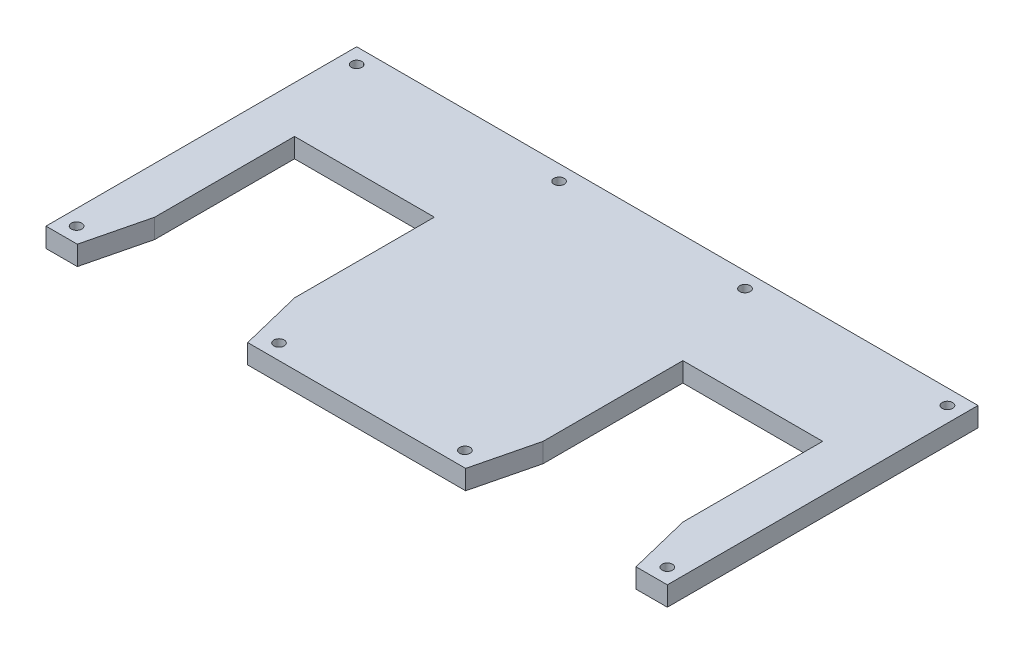
ISO-10303-21;
HEADER;
FILE_DESCRIPTION(('STEP AP214'),'2;1');
FILE_NAME('part.step','',(''),(''),'','','');
FILE_SCHEMA(('AUTOMOTIVE_DESIGN { 1 0 10303 214 1 1 1 1 }'));
ENDSEC;
DATA;
#1=APPLICATION_CONTEXT('core data for automotive mechanical design processes');
#2=APPLICATION_PROTOCOL_DEFINITION('international standard','automotive_design',2000,#1);
#3=PRODUCT_CONTEXT('',#1,'mechanical');
#4=PRODUCT('Part','Part','',(#3));
#5=PRODUCT_RELATED_PRODUCT_CATEGORY('part','',(#4));
#6=PRODUCT_DEFINITION_FORMATION('','',#4);
#7=PRODUCT_DEFINITION_CONTEXT('part definition',#1,'design');
#8=PRODUCT_DEFINITION('design','',#6,#7);
#9=PRODUCT_DEFINITION_SHAPE('','',#8);
#10=(LENGTH_UNIT() NAMED_UNIT(*) SI_UNIT(.MILLI.,.METRE.));
#11=(NAMED_UNIT(*) PLANE_ANGLE_UNIT() SI_UNIT($,.RADIAN.));
#12=(NAMED_UNIT(*) SI_UNIT($,.STERADIAN.) SOLID_ANGLE_UNIT());
#13=UNCERTAINTY_MEASURE_WITH_UNIT(LENGTH_MEASURE(1.E-05),#10,'distance_accuracy_value','');
#14=(GEOMETRIC_REPRESENTATION_CONTEXT(3) GLOBAL_UNCERTAINTY_ASSIGNED_CONTEXT((#13)) GLOBAL_UNIT_ASSIGNED_CONTEXT((#10,
#11,#12)) REPRESENTATION_CONTEXT('',''));
#15=CARTESIAN_POINT('',(0.,0.,0.));
#16=DIRECTION('',(0.,0.,1.));
#17=DIRECTION('',(1.,0.,0.));
#18=AXIS2_PLACEMENT_3D('',#15,#16,#17);
#19=CARTESIAN_POINT('',(0.,6.35,0.));
#20=DIRECTION('',(0.,0.,-1.));
#21=DIRECTION('',(-1.,0.,0.));
#22=AXIS2_PLACEMENT_3D('',#19,#20,#21);
#23=PLANE('',#22);
#24=DIRECTION('',(1.,0.,0.));
#25=VECTOR('',#24,1.);
#26=CARTESIAN_POINT('',(0.,0.,0.));
#27=LINE('',#26,#25);
#28=CARTESIAN_POINT('',(-61.04,0.,0.));
#29=VERTEX_POINT('',#28);
#30=CARTESIAN_POINT('',(10.24,0.,0.));
#31=VERTEX_POINT('',#30);
#32=EDGE_CURVE('E145',#29,#31,#27,.T.);
#33=ORIENTED_EDGE('',*,*,#32,.T.);
#34=DIRECTION('',(0.,-1.,0.));
#35=VECTOR('',#34,1.);
#36=CARTESIAN_POINT('',(10.24,6.35,0.));
#37=LINE('',#36,#35);
#38=CARTESIAN_POINT('',(10.24,6.35,0.));
#39=VERTEX_POINT('',#38);
#40=EDGE_CURVE('E11',#39,#31,#37,.T.);
#41=ORIENTED_EDGE('',*,*,#40,.F.);
#42=DIRECTION('',(1.,0.,0.));
#43=VECTOR('',#42,1.);
#44=CARTESIAN_POINT('',(0.,6.35,0.));
#45=LINE('',#44,#43);
#46=CARTESIAN_POINT('',(-61.04,6.35,0.));
#47=VERTEX_POINT('',#46);
#48=EDGE_CURVE('E101',#47,#39,#45,.T.);
#49=ORIENTED_EDGE('',*,*,#48,.F.);
#50=DIRECTION('',(0.,-1.,0.));
#51=VECTOR('',#50,1.);
#52=CARTESIAN_POINT('',(-61.04,6.35,0.));
#53=LINE('',#52,#51);
#54=EDGE_CURVE('E210',#47,#29,#53,.T.);
#55=ORIENTED_EDGE('',*,*,#54,.T.);
#56=EDGE_LOOP('',(#33,#41,#49,#55));
#57=FACE_BOUND('',#56,.T.);
#58=ADVANCED_FACE('F41',(#57),#23,.F.);
#59=CARTESIAN_POINT('',(10.24,6.35,0.));
#60=DIRECTION('',(-0.971035351018297,0.,-0.238935863931668));
#61=DIRECTION('',(-0.238935863931668,0.,0.971035351018297));
#62=AXIS2_PLACEMENT_3D('',#59,#60,#61);
#63=PLANE('',#62);
#64=DIRECTION('',(0.238935863931668,0.,-0.971035351018297));
#65=VECTOR('',#64,1.);
#66=CARTESIAN_POINT('',(10.24,0.,0.));
#67=LINE('',#66,#65);
#68=CARTESIAN_POINT('',(15.24,0.,-20.32));
#69=VERTEX_POINT('',#68);
#70=EDGE_CURVE('E147',#31,#69,#67,.T.);
#71=ORIENTED_EDGE('',*,*,#70,.T.);
#72=DIRECTION('',(0.,-1.,0.));
#73=VECTOR('',#72,1.);
#74=CARTESIAN_POINT('',(15.24,6.35,-20.32));
#75=LINE('',#74,#73);
#76=CARTESIAN_POINT('',(15.24,6.35,-20.32));
#77=VERTEX_POINT('',#76);
#78=EDGE_CURVE('E49',#77,#69,#75,.T.);
#79=ORIENTED_EDGE('',*,*,#78,.F.);
#80=DIRECTION('',(0.238935863931668,0.,-0.971035351018297));
#81=VECTOR('',#80,1.);
#82=CARTESIAN_POINT('',(10.24,6.35,0.));
#83=LINE('',#82,#81);
#84=EDGE_CURVE('E197',#39,#77,#83,.T.);
#85=ORIENTED_EDGE('',*,*,#84,.F.);
#86=ORIENTED_EDGE('',*,*,#40,.T.);
#87=EDGE_LOOP('',(#71,#79,#85,#86));
#88=FACE_BOUND('',#87,.T.);
#89=ADVANCED_FACE('F333',(#88),#63,.F.);
#90=CARTESIAN_POINT('',(15.24,6.35,-20.32));
#91=DIRECTION('',(-1.,0.,0.));
#92=DIRECTION('',(0.,0.,1.));
#93=AXIS2_PLACEMENT_3D('',#90,#91,#92);
#94=PLANE('',#93);
#95=DIRECTION('',(0.,0.,-1.));
#96=VECTOR('',#95,1.);
#97=CARTESIAN_POINT('',(15.24,0.,-20.32));
#98=LINE('',#97,#96);
#99=CARTESIAN_POINT('',(15.24,0.,-66.04));
#100=VERTEX_POINT('',#99);
#101=EDGE_CURVE('E150',#69,#100,#98,.T.);
#102=ORIENTED_EDGE('',*,*,#101,.T.);
#103=DIRECTION('',(0.,-1.,0.));
#104=VECTOR('',#103,1.);
#105=CARTESIAN_POINT('',(15.24,6.35,-66.04));
#106=LINE('',#105,#104);
#107=CARTESIAN_POINT('',(15.24,6.35,-66.04));
#108=VERTEX_POINT('',#107);
#109=EDGE_CURVE('E168',#108,#100,#106,.T.);
#110=ORIENTED_EDGE('',*,*,#109,.F.);
#111=DIRECTION('',(0.,0.,-1.));
#112=VECTOR('',#111,1.);
#113=CARTESIAN_POINT('',(15.24,6.35,-20.32));
#114=LINE('',#113,#112);
#115=EDGE_CURVE('E177',#77,#108,#114,.T.);
#116=ORIENTED_EDGE('',*,*,#115,.F.);
#117=ORIENTED_EDGE('',*,*,#78,.T.);
#118=EDGE_LOOP('',(#102,#110,#116,#117));
#119=FACE_BOUND('',#118,.T.);
#120=ADVANCED_FACE('F175',(#119),#94,.F.);
#121=CARTESIAN_POINT('',(15.24,6.35,-66.04));
#122=DIRECTION('',(0.,0.,-1.));
#123=DIRECTION('',(-1.,0.,0.));
#124=AXIS2_PLACEMENT_3D('',#121,#122,#123);
#125=PLANE('',#124);
#126=DIRECTION('',(1.,0.,0.));
#127=VECTOR('',#126,1.);
#128=CARTESIAN_POINT('',(15.24,0.,-66.04));
#129=LINE('',#128,#127);
#130=CARTESIAN_POINT('',(60.96,0.,-66.04));
#131=VERTEX_POINT('',#130);
#132=EDGE_CURVE('E152',#100,#131,#129,.T.);
#133=ORIENTED_EDGE('',*,*,#132,.T.);
#134=DIRECTION('',(0.,-1.,0.));
#135=VECTOR('',#134,1.);
#136=CARTESIAN_POINT('',(60.96,6.35,-66.04));
#137=LINE('',#136,#135);
#138=CARTESIAN_POINT('',(60.96,6.35,-66.04));
#139=VERTEX_POINT('',#138);
#140=EDGE_CURVE('E165',#139,#131,#137,.T.);
#141=ORIENTED_EDGE('',*,*,#140,.F.);
#142=DIRECTION('',(1.,0.,0.));
#143=VECTOR('',#142,1.);
#144=CARTESIAN_POINT('',(15.24,6.35,-66.04));
#145=LINE('',#144,#143);
#146=EDGE_CURVE('E193',#108,#139,#145,.T.);
#147=ORIENTED_EDGE('',*,*,#146,.F.);
#148=ORIENTED_EDGE('',*,*,#109,.T.);
#149=EDGE_LOOP('',(#133,#141,#147,#148));
#150=FACE_BOUND('',#149,.T.);
#151=ADVANCED_FACE('F189',(#150),#125,.F.);
#152=CARTESIAN_POINT('',(60.96,6.35,-66.04));
#153=DIRECTION('',(1.,0.,0.));
#154=DIRECTION('',(0.,0.,-1.));
#155=AXIS2_PLACEMENT_3D('',#152,#153,#154);
#156=PLANE('',#155);
#157=DIRECTION('',(0.,0.,1.));
#158=VECTOR('',#157,1.);
#159=CARTESIAN_POINT('',(60.96,0.,-66.04));
#160=LINE('',#159,#158);
#161=CARTESIAN_POINT('',(60.96,0.,-20.32));
#162=VERTEX_POINT('',#161);
#163=EDGE_CURVE('E154',#131,#162,#160,.T.);
#164=ORIENTED_EDGE('',*,*,#163,.T.);
#165=DIRECTION('',(0.,-1.,0.));
#166=VECTOR('',#165,1.);
#167=CARTESIAN_POINT('',(60.96,6.35,-20.32));
#168=LINE('',#167,#166);
#169=CARTESIAN_POINT('',(60.96,6.35,-20.32));
#170=VERTEX_POINT('',#169);
#171=EDGE_CURVE('E134',#170,#162,#168,.T.);
#172=ORIENTED_EDGE('',*,*,#171,.F.);
#173=DIRECTION('',(0.,0.,1.));
#174=VECTOR('',#173,1.);
#175=CARTESIAN_POINT('',(60.96,6.35,-66.04));
#176=LINE('',#175,#174);
#177=EDGE_CURVE('E125',#139,#170,#176,.T.);
#178=ORIENTED_EDGE('',*,*,#177,.F.);
#179=ORIENTED_EDGE('',*,*,#140,.T.);
#180=EDGE_LOOP('',(#164,#172,#178,#179));
#181=FACE_BOUND('',#180,.T.);
#182=ADVANCED_FACE('F192',(#181),#156,.F.);
#183=CARTESIAN_POINT('',(60.96,6.35,-20.32));
#184=DIRECTION('',(0.971035351018297,0.,-0.238935863931668));
#185=DIRECTION('',(-0.238935863931668,0.,-0.971035351018297));
#186=AXIS2_PLACEMENT_3D('',#183,#184,#185);
#187=PLANE('',#186);
#188=DIRECTION('',(0.238935863931668,0.,0.971035351018297));
#189=VECTOR('',#188,1.);
#190=CARTESIAN_POINT('',(60.96,0.,-20.32));
#191=LINE('',#190,#189);
#192=CARTESIAN_POINT('',(65.96,0.,0.));
#193=VERTEX_POINT('',#192);
#194=EDGE_CURVE('E133',#162,#193,#191,.T.);
#195=ORIENTED_EDGE('',*,*,#194,.T.);
#196=DIRECTION('',(0.,-1.,0.));
#197=VECTOR('',#196,1.);
#198=CARTESIAN_POINT('',(65.96,6.35,0.));
#199=LINE('',#198,#197);
#200=CARTESIAN_POINT('',(65.96,6.35,0.));
#201=VERTEX_POINT('',#200);
#202=EDGE_CURVE('E130',#201,#193,#199,.T.);
#203=ORIENTED_EDGE('',*,*,#202,.F.);
#204=DIRECTION('',(0.238935863931668,0.,0.971035351018297));
#205=VECTOR('',#204,1.);
#206=CARTESIAN_POINT('',(60.96,6.35,-20.32));
#207=LINE('',#206,#205);
#208=EDGE_CURVE('E118',#170,#201,#207,.T.);
#209=ORIENTED_EDGE('',*,*,#208,.F.);
#210=ORIENTED_EDGE('',*,*,#171,.T.);
#211=EDGE_LOOP('',(#195,#203,#209,#210));
#212=FACE_BOUND('',#211,.T.);
#213=ADVANCED_FACE('F131',(#212),#187,.F.);
#214=CARTESIAN_POINT('',(65.96,6.35,0.));
#215=DIRECTION('',(0.,0.,-1.));
#216=DIRECTION('',(-1.,0.,0.));
#217=AXIS2_PLACEMENT_3D('',#214,#215,#216);
#218=PLANE('',#217);
#219=DIRECTION('',(1.,0.,0.));
#220=VECTOR('',#219,1.);
#221=CARTESIAN_POINT('',(65.96,0.,0.));
#222=LINE('',#221,#220);
#223=CARTESIAN_POINT('',(76.2,0.,0.));
#224=VERTEX_POINT('',#223);
#225=EDGE_CURVE('E87',#193,#224,#222,.T.);
#226=ORIENTED_EDGE('',*,*,#225,.T.);
#227=DIRECTION('',(0.,-1.,0.));
#228=VECTOR('',#227,1.);
#229=CARTESIAN_POINT('',(76.2,6.35,0.));
#230=LINE('',#229,#228);
#231=CARTESIAN_POINT('',(76.2,6.35,0.));
#232=VERTEX_POINT('',#231);
#233=EDGE_CURVE('E135',#232,#224,#230,.T.);
#234=ORIENTED_EDGE('',*,*,#233,.F.);
#235=DIRECTION('',(1.,0.,0.));
#236=VECTOR('',#235,1.);
#237=CARTESIAN_POINT('',(65.96,6.35,0.));
#238=LINE('',#237,#236);
#239=EDGE_CURVE('E123',#201,#232,#238,.T.);
#240=ORIENTED_EDGE('',*,*,#239,.F.);
#241=ORIENTED_EDGE('',*,*,#202,.T.);
#242=EDGE_LOOP('',(#226,#234,#240,#241));
#243=FACE_BOUND('',#242,.T.);
#244=ADVANCED_FACE('F137',(#243),#218,.F.);
#245=CARTESIAN_POINT('',(76.2,6.35,0.));
#246=DIRECTION('',(-1.,0.,0.));
#247=DIRECTION('',(0.,0.,1.));
#248=AXIS2_PLACEMENT_3D('',#245,#246,#247);
#249=PLANE('',#248);
#250=DIRECTION('',(0.,0.,-1.));
#251=VECTOR('',#250,1.);
#252=CARTESIAN_POINT('',(76.2,0.,0.));
#253=LINE('',#252,#251);
#254=CARTESIAN_POINT('',(76.2,0.,-101.6));
#255=VERTEX_POINT('',#254);
#256=EDGE_CURVE('E93',#224,#255,#253,.T.);
#257=ORIENTED_EDGE('',*,*,#256,.T.);
#258=DIRECTION('',(0.,-1.,0.));
#259=VECTOR('',#258,1.);
#260=CARTESIAN_POINT('',(76.2,6.35,-101.6));
#261=LINE('',#260,#259);
#262=CARTESIAN_POINT('',(76.2,6.35,-101.6));
#263=VERTEX_POINT('',#262);
#264=EDGE_CURVE('E144',#263,#255,#261,.T.);
#265=ORIENTED_EDGE('',*,*,#264,.F.);
#266=DIRECTION('',(0.,0.,-1.));
#267=VECTOR('',#266,1.);
#268=CARTESIAN_POINT('',(76.2,6.35,0.));
#269=LINE('',#268,#267);
#270=EDGE_CURVE('E57',#232,#263,#269,.T.);
#271=ORIENTED_EDGE('',*,*,#270,.F.);
#272=ORIENTED_EDGE('',*,*,#233,.T.);
#273=EDGE_LOOP('',(#257,#265,#271,#272));
#274=FACE_BOUND('',#273,.T.);
#275=ADVANCED_FACE('F440',(#274),#249,.F.);
#276=CARTESIAN_POINT('',(0.,6.35,-101.6));
#277=DIRECTION('',(0.,0.,1.));
#278=DIRECTION('',(1.,0.,0.));
#279=AXIS2_PLACEMENT_3D('',#276,#277,#278);
#280=PLANE('',#279);
#281=DIRECTION('',(-1.,0.,0.));
#282=VECTOR('',#281,1.);
#283=CARTESIAN_POINT('',(0.,0.,-101.6));
#284=LINE('',#283,#282);
#285=CARTESIAN_POINT('',(-127.,0.,-101.6));
#286=VERTEX_POINT('',#285);
#287=EDGE_CURVE('E159',#255,#286,#284,.T.);
#288=ORIENTED_EDGE('',*,*,#287,.T.);
#289=DIRECTION('',(0.,-1.,0.));
#290=VECTOR('',#289,1.);
#291=CARTESIAN_POINT('',(-127.,6.35,-101.6));
#292=LINE('',#291,#290);
#293=CARTESIAN_POINT('',(-127.,6.35,-101.6));
#294=VERTEX_POINT('',#293);
#295=EDGE_CURVE('E244',#294,#286,#292,.T.);
#296=ORIENTED_EDGE('',*,*,#295,.F.);
#297=DIRECTION('',(-1.,0.,0.));
#298=VECTOR('',#297,1.);
#299=CARTESIAN_POINT('',(0.,6.35,-101.6));
#300=LINE('',#299,#298);
#301=EDGE_CURVE('E139',#263,#294,#300,.T.);
#302=ORIENTED_EDGE('',*,*,#301,.F.);
#303=ORIENTED_EDGE('',*,*,#264,.T.);
#304=EDGE_LOOP('',(#288,#296,#302,#303));
#305=FACE_BOUND('',#304,.T.);
#306=ADVANCED_FACE('F392',(#305),#280,.F.);
#307=CARTESIAN_POINT('',(0.,6.35,0.));
#308=DIRECTION('',(0.,-1.,0.));
#309=DIRECTION('',(0.,0.,-1.));
#310=AXIS2_PLACEMENT_3D('',#307,#308,#309);
#311=PLANE('',#310);
#312=CARTESIAN_POINT('',(5.,6.35,-5.));
#313=DIRECTION('',(0.,1.,0.));
#314=DIRECTION('',(0.,0.,-1.));
#315=AXIS2_PLACEMENT_3D('',#312,#313,#314);
#316=CIRCLE('',#315,1.7);
#317=CARTESIAN_POINT('',(5.,6.35,-6.7));
#318=VERTEX_POINT('',#317);
#319=EDGE_CURVE('E209',#318,#318,#316,.T.);
#320=ORIENTED_EDGE('',*,*,#319,.F.);
#321=EDGE_LOOP('',(#320));
#322=FACE_BOUND('',#321,.T.);
#323=CARTESIAN_POINT('',(71.2,6.35,-5.00000000000002));
#324=DIRECTION('',(0.,1.,0.));
#325=DIRECTION('',(0.,0.,1.));
#326=AXIS2_PLACEMENT_3D('',#323,#324,#325);
#327=CIRCLE('',#326,1.7);
#328=CARTESIAN_POINT('',(71.2,6.35,-3.30000000000002));
#329=VERTEX_POINT('',#328);
#330=EDGE_CURVE('E216',#329,#329,#327,.T.);
#331=ORIENTED_EDGE('',*,*,#330,.F.);
#332=EDGE_LOOP('',(#331));
#333=FACE_BOUND('',#332,.T.);
#334=CARTESIAN_POINT('',(71.2,6.35,-96.6));
#335=DIRECTION('',(0.,1.,0.));
#336=DIRECTION('',(0.,0.,-1.));
#337=AXIS2_PLACEMENT_3D('',#334,#335,#336);
#338=CIRCLE('',#337,1.7);
#339=CARTESIAN_POINT('',(71.2,6.35,-98.3));
#340=VERTEX_POINT('',#339);
#341=EDGE_CURVE('E203',#340,#340,#338,.T.);
#342=ORIENTED_EDGE('',*,*,#341,.F.);
#343=EDGE_LOOP('',(#342));
#344=FACE_BOUND('',#343,.T.);
#345=CARTESIAN_POINT('',(5.,6.35,-96.6));
#346=DIRECTION('',(0.,1.,0.));
#347=DIRECTION('',(0.,0.,1.));
#348=AXIS2_PLACEMENT_3D('',#345,#346,#347);
#349=CIRCLE('',#348,1.7);
#350=CARTESIAN_POINT('',(5.,6.35,-94.9));
#351=VERTEX_POINT('',#350);
#352=EDGE_CURVE('E200',#351,#351,#349,.T.);
#353=ORIENTED_EDGE('',*,*,#352,.F.);
#354=EDGE_LOOP('',(#353));
#355=FACE_BOUND('',#354,.T.);
#356=ORIENTED_EDGE('',*,*,#301,.T.);
#357=DIRECTION('',(0.,0.,-1.));
#358=VECTOR('',#357,1.);
#359=CARTESIAN_POINT('',(-127.,6.35,0.));
#360=LINE('',#359,#358);
#361=CARTESIAN_POINT('',(-127.,6.35,0.));
#362=VERTEX_POINT('',#361);
#363=EDGE_CURVE('E247',#362,#294,#360,.T.);
#364=ORIENTED_EDGE('',*,*,#363,.F.);
#365=DIRECTION('',(-1.,0.,0.));
#366=VECTOR('',#365,1.);
#367=CARTESIAN_POINT('',(-116.76,6.35,0.));
#368=LINE('',#367,#366);
#369=CARTESIAN_POINT('',(-116.76,6.35,0.));
#370=VERTEX_POINT('',#369);
#371=EDGE_CURVE('E273',#370,#362,#368,.T.);
#372=ORIENTED_EDGE('',*,*,#371,.F.);
#373=DIRECTION('',(-0.238935863931668,0.,0.971035351018297));
#374=VECTOR('',#373,1.);
#375=CARTESIAN_POINT('',(-111.76,6.35,-20.32));
#376=LINE('',#375,#374);
#377=CARTESIAN_POINT('',(-111.76,6.35,-20.32));
#378=VERTEX_POINT('',#377);
#379=EDGE_CURVE('E276',#378,#370,#376,.T.);
#380=ORIENTED_EDGE('',*,*,#379,.F.);
#381=DIRECTION('',(0.,0.,1.));
#382=VECTOR('',#381,1.);
#383=CARTESIAN_POINT('',(-111.76,6.35,-66.04));
#384=LINE('',#383,#382);
#385=CARTESIAN_POINT('',(-111.76,6.35,-66.04));
#386=VERTEX_POINT('',#385);
#387=EDGE_CURVE('E279',#386,#378,#384,.T.);
#388=ORIENTED_EDGE('',*,*,#387,.F.);
#389=DIRECTION('',(-1.,0.,0.));
#390=VECTOR('',#389,1.);
#391=CARTESIAN_POINT('',(-66.04,6.35,-66.04));
#392=LINE('',#391,#390);
#393=CARTESIAN_POINT('',(-66.04,6.35,-66.04));
#394=VERTEX_POINT('',#393);
#395=EDGE_CURVE('E282',#394,#386,#392,.T.);
#396=ORIENTED_EDGE('',*,*,#395,.F.);
#397=DIRECTION('',(0.,0.,-1.));
#398=VECTOR('',#397,1.);
#399=CARTESIAN_POINT('',(-66.04,6.35,-20.32));
#400=LINE('',#399,#398);
#401=CARTESIAN_POINT('',(-66.04,6.35,-20.32));
#402=VERTEX_POINT('',#401);
#403=EDGE_CURVE('E285',#402,#394,#400,.T.);
#404=ORIENTED_EDGE('',*,*,#403,.F.);
#405=DIRECTION('',(-0.238935863931668,0.,-0.971035351018297));
#406=VECTOR('',#405,1.);
#407=CARTESIAN_POINT('',(-61.04,6.35,0.));
#408=LINE('',#407,#406);
#409=EDGE_CURVE('E251',#47,#402,#408,.T.);
#410=ORIENTED_EDGE('',*,*,#409,.F.);
#411=ORIENTED_EDGE('',*,*,#48,.T.);
#412=ORIENTED_EDGE('',*,*,#84,.T.);
#413=ORIENTED_EDGE('',*,*,#115,.T.);
#414=ORIENTED_EDGE('',*,*,#146,.T.);
#415=ORIENTED_EDGE('',*,*,#177,.T.);
#416=ORIENTED_EDGE('',*,*,#208,.T.);
#417=ORIENTED_EDGE('',*,*,#239,.T.);
#418=ORIENTED_EDGE('',*,*,#270,.T.);
#419=EDGE_LOOP('',(#356,#364,#372,#380,#388,#396,#404,#410,#411,#412,#413,#414,#415,#416,#417,#418));
#420=FACE_BOUND('',#419,.T.);
#421=CARTESIAN_POINT('',(-55.8,6.35,-5.));
#422=DIRECTION('',(0.,-1.,0.));
#423=DIRECTION('',(0.,0.,-1.));
#424=AXIS2_PLACEMENT_3D('',#421,#422,#423);
#425=CIRCLE('',#424,1.7);
#426=CARTESIAN_POINT('',(-55.8,6.35,-6.7));
#427=VERTEX_POINT('',#426);
#428=EDGE_CURVE('E299',#427,#427,#425,.T.);
#429=ORIENTED_EDGE('',*,*,#428,.T.);
#430=EDGE_LOOP('',(#429));
#431=FACE_BOUND('',#430,.T.);
#432=CARTESIAN_POINT('',(-122.,6.35,-5.00000000000002));
#433=DIRECTION('',(0.,-1.,0.));
#434=DIRECTION('',(0.,0.,1.));
#435=AXIS2_PLACEMENT_3D('',#432,#433,#434);
#436=CIRCLE('',#435,1.7);
#437=CARTESIAN_POINT('',(-122.,6.35,-3.30000000000002));
#438=VERTEX_POINT('',#437);
#439=EDGE_CURVE('E305',#438,#438,#436,.T.);
#440=ORIENTED_EDGE('',*,*,#439,.T.);
#441=EDGE_LOOP('',(#440));
#442=FACE_BOUND('',#441,.T.);
#443=CARTESIAN_POINT('',(-122.,6.35,-96.6));
#444=DIRECTION('',(0.,-1.,0.));
#445=DIRECTION('',(0.,0.,-1.));
#446=AXIS2_PLACEMENT_3D('',#443,#444,#445);
#447=CIRCLE('',#446,1.7);
#448=CARTESIAN_POINT('',(-122.,6.35,-98.3));
#449=VERTEX_POINT('',#448);
#450=EDGE_CURVE('E293',#449,#449,#447,.T.);
#451=ORIENTED_EDGE('',*,*,#450,.T.);
#452=EDGE_LOOP('',(#451));
#453=FACE_BOUND('',#452,.T.);
#454=CARTESIAN_POINT('',(-55.8,6.35,-96.6));
#455=DIRECTION('',(0.,-1.,0.));
#456=DIRECTION('',(0.,0.,1.));
#457=AXIS2_PLACEMENT_3D('',#454,#455,#456);
#458=CIRCLE('',#457,1.7);
#459=CARTESIAN_POINT('',(-55.8,6.35,-94.9));
#460=VERTEX_POINT('',#459);
#461=EDGE_CURVE('E290',#460,#460,#458,.T.);
#462=ORIENTED_EDGE('',*,*,#461,.T.);
#463=EDGE_LOOP('',(#462));
#464=FACE_BOUND('',#463,.T.);
#465=ADVANCED_FACE('F120',(#322,#333,#344,#355,#420,#431,#442,#453,#464),#311,.F.);
#466=CARTESIAN_POINT('',(0.,0.,0.));
#467=DIRECTION('',(0.,-1.,0.));
#468=DIRECTION('',(0.,0.,-1.));
#469=AXIS2_PLACEMENT_3D('',#466,#467,#468);
#470=PLANE('',#469);
#471=CARTESIAN_POINT('',(5.,0.,-5.));
#472=DIRECTION('',(0.,1.,0.));
#473=DIRECTION('',(0.,0.,-1.));
#474=AXIS2_PLACEMENT_3D('',#471,#472,#473);
#475=CIRCLE('',#474,1.7);
#476=CARTESIAN_POINT('',(5.,0.,-6.7));
#477=VERTEX_POINT('',#476);
#478=EDGE_CURVE('E206',#477,#477,#475,.T.);
#479=ORIENTED_EDGE('',*,*,#478,.T.);
#480=EDGE_LOOP('',(#479));
#481=FACE_BOUND('',#480,.T.);
#482=CARTESIAN_POINT('',(71.2,0.,-5.00000000000002));
#483=DIRECTION('',(0.,1.,0.));
#484=DIRECTION('',(0.,0.,1.));
#485=AXIS2_PLACEMENT_3D('',#482,#483,#484);
#486=CIRCLE('',#485,1.7);
#487=CARTESIAN_POINT('',(71.2,0.,-3.30000000000002));
#488=VERTEX_POINT('',#487);
#489=EDGE_CURVE('E213',#488,#488,#486,.T.);
#490=ORIENTED_EDGE('',*,*,#489,.T.);
#491=EDGE_LOOP('',(#490));
#492=FACE_BOUND('',#491,.T.);
#493=CARTESIAN_POINT('',(71.2,0.,-96.6));
#494=DIRECTION('',(0.,1.,0.));
#495=DIRECTION('',(0.,0.,-1.));
#496=AXIS2_PLACEMENT_3D('',#493,#494,#495);
#497=CIRCLE('',#496,1.7);
#498=CARTESIAN_POINT('',(71.2,0.,-98.3));
#499=VERTEX_POINT('',#498);
#500=EDGE_CURVE('E219',#499,#499,#497,.T.);
#501=ORIENTED_EDGE('',*,*,#500,.T.);
#502=EDGE_LOOP('',(#501));
#503=FACE_BOUND('',#502,.T.);
#504=CARTESIAN_POINT('',(5.,0.,-96.6));
#505=DIRECTION('',(0.,1.,0.));
#506=DIRECTION('',(0.,0.,1.));
#507=AXIS2_PLACEMENT_3D('',#504,#505,#506);
#508=CIRCLE('',#507,1.7);
#509=CARTESIAN_POINT('',(5.,0.,-94.9));
#510=VERTEX_POINT('',#509);
#511=EDGE_CURVE('E148',#510,#510,#508,.T.);
#512=ORIENTED_EDGE('',*,*,#511,.T.);
#513=EDGE_LOOP('',(#512));
#514=FACE_BOUND('',#513,.T.);
#515=ORIENTED_EDGE('',*,*,#32,.F.);
#516=DIRECTION('',(-0.238935863931668,0.,-0.971035351018297));
#517=VECTOR('',#516,1.);
#518=CARTESIAN_POINT('',(-61.04,0.,0.));
#519=LINE('',#518,#517);
#520=CARTESIAN_POINT('',(-66.04,0.,-20.32));
#521=VERTEX_POINT('',#520);
#522=EDGE_CURVE('E267',#29,#521,#519,.T.);
#523=ORIENTED_EDGE('',*,*,#522,.T.);
#524=DIRECTION('',(0.,0.,-1.));
#525=VECTOR('',#524,1.);
#526=CARTESIAN_POINT('',(-66.04,0.,-20.32));
#527=LINE('',#526,#525);
#528=CARTESIAN_POINT('',(-66.04,0.,-66.04));
#529=VERTEX_POINT('',#528);
#530=EDGE_CURVE('E264',#521,#529,#527,.T.);
#531=ORIENTED_EDGE('',*,*,#530,.T.);
#532=DIRECTION('',(-1.,0.,0.));
#533=VECTOR('',#532,1.);
#534=CARTESIAN_POINT('',(-66.04,0.,-66.04));
#535=LINE('',#534,#533);
#536=CARTESIAN_POINT('',(-111.76,0.,-66.04));
#537=VERTEX_POINT('',#536);
#538=EDGE_CURVE('E261',#529,#537,#535,.T.);
#539=ORIENTED_EDGE('',*,*,#538,.T.);
#540=DIRECTION('',(0.,0.,1.));
#541=VECTOR('',#540,1.);
#542=CARTESIAN_POINT('',(-111.76,0.,-66.04));
#543=LINE('',#542,#541);
#544=CARTESIAN_POINT('',(-111.76,0.,-20.32));
#545=VERTEX_POINT('',#544);
#546=EDGE_CURVE('E258',#537,#545,#543,.T.);
#547=ORIENTED_EDGE('',*,*,#546,.T.);
#548=DIRECTION('',(-0.238935863931668,0.,0.971035351018297));
#549=VECTOR('',#548,1.);
#550=CARTESIAN_POINT('',(-111.76,0.,-20.32));
#551=LINE('',#550,#549);
#552=CARTESIAN_POINT('',(-116.76,0.,0.));
#553=VERTEX_POINT('',#552);
#554=EDGE_CURVE('E255',#545,#553,#551,.T.);
#555=ORIENTED_EDGE('',*,*,#554,.T.);
#556=DIRECTION('',(-1.,0.,0.));
#557=VECTOR('',#556,1.);
#558=CARTESIAN_POINT('',(-116.76,0.,0.));
#559=LINE('',#558,#557);
#560=CARTESIAN_POINT('',(-127.,0.,0.));
#561=VERTEX_POINT('',#560);
#562=EDGE_CURVE('E252',#553,#561,#559,.T.);
#563=ORIENTED_EDGE('',*,*,#562,.T.);
#564=DIRECTION('',(0.,0.,-1.));
#565=VECTOR('',#564,1.);
#566=CARTESIAN_POINT('',(-127.,0.,0.));
#567=LINE('',#566,#565);
#568=EDGE_CURVE('E248',#561,#286,#567,.T.);
#569=ORIENTED_EDGE('',*,*,#568,.T.);
#570=ORIENTED_EDGE('',*,*,#287,.F.);
#571=ORIENTED_EDGE('',*,*,#256,.F.);
#572=ORIENTED_EDGE('',*,*,#225,.F.);
#573=ORIENTED_EDGE('',*,*,#194,.F.);
#574=ORIENTED_EDGE('',*,*,#163,.F.);
#575=ORIENTED_EDGE('',*,*,#132,.F.);
#576=ORIENTED_EDGE('',*,*,#101,.F.);
#577=ORIENTED_EDGE('',*,*,#70,.F.);
#578=EDGE_LOOP('',(#515,#523,#531,#539,#547,#555,#563,#569,#570,#571,#572,#573,#574,#575,#576,#577));
#579=FACE_BOUND('',#578,.T.);
#580=CARTESIAN_POINT('',(-55.8,0.,-5.));
#581=DIRECTION('',(0.,-1.,0.));
#582=DIRECTION('',(0.,0.,-1.));
#583=AXIS2_PLACEMENT_3D('',#580,#581,#582);
#584=CIRCLE('',#583,1.7);
#585=CARTESIAN_POINT('',(-55.8,0.,-6.7));
#586=VERTEX_POINT('',#585);
#587=EDGE_CURVE('E296',#586,#586,#584,.T.);
#588=ORIENTED_EDGE('',*,*,#587,.F.);
#589=EDGE_LOOP('',(#588));
#590=FACE_BOUND('',#589,.T.);
#591=CARTESIAN_POINT('',(-122.,0.,-5.00000000000002));
#592=DIRECTION('',(0.,-1.,0.));
#593=DIRECTION('',(0.,0.,1.));
#594=AXIS2_PLACEMENT_3D('',#591,#592,#593);
#595=CIRCLE('',#594,1.7);
#596=CARTESIAN_POINT('',(-122.,0.,-3.30000000000002));
#597=VERTEX_POINT('',#596);
#598=EDGE_CURVE('E302',#597,#597,#595,.T.);
#599=ORIENTED_EDGE('',*,*,#598,.F.);
#600=EDGE_LOOP('',(#599));
#601=FACE_BOUND('',#600,.T.);
#602=CARTESIAN_POINT('',(-122.,0.,-96.6));
#603=DIRECTION('',(0.,-1.,0.));
#604=DIRECTION('',(0.,0.,-1.));
#605=AXIS2_PLACEMENT_3D('',#602,#603,#604);
#606=CIRCLE('',#605,1.7);
#607=CARTESIAN_POINT('',(-122.,0.,-98.3));
#608=VERTEX_POINT('',#607);
#609=EDGE_CURVE('E308',#608,#608,#606,.T.);
#610=ORIENTED_EDGE('',*,*,#609,.F.);
#611=EDGE_LOOP('',(#610));
#612=FACE_BOUND('',#611,.T.);
#613=CARTESIAN_POINT('',(-55.8,0.,-96.6));
#614=DIRECTION('',(0.,-1.,0.));
#615=DIRECTION('',(0.,0.,1.));
#616=AXIS2_PLACEMENT_3D('',#613,#614,#615);
#617=CIRCLE('',#616,1.7);
#618=CARTESIAN_POINT('',(-55.8,0.,-94.9));
#619=VERTEX_POINT('',#618);
#620=EDGE_CURVE('E270',#619,#619,#617,.T.);
#621=ORIENTED_EDGE('',*,*,#620,.F.);
#622=EDGE_LOOP('',(#621));
#623=FACE_BOUND('',#622,.T.);
#624=ADVANCED_FACE('F184',(#481,#492,#503,#514,#579,#590,#601,#612,#623),#470,.T.);
#625=CARTESIAN_POINT('',(5.,0.,-96.6));
#626=DIRECTION('',(0.,1.,0.));
#627=DIRECTION('',(0.,0.,1.));
#628=AXIS2_PLACEMENT_3D('',#625,#626,#627);
#629=CYLINDRICAL_SURFACE('',#628,1.7);
#630=ORIENTED_EDGE('',*,*,#511,.F.);
#631=EDGE_LOOP('',(#630));
#632=FACE_BOUND('',#631,.T.);
#633=ORIENTED_EDGE('',*,*,#352,.T.);
#634=EDGE_LOOP('',(#633));
#635=FACE_BOUND('',#634,.T.);
#636=ADVANCED_FACE('F423',(#632,#635),#629,.F.);
#637=CARTESIAN_POINT('',(71.2,0.,-96.6));
#638=DIRECTION('',(0.,1.,0.));
#639=DIRECTION('',(0.,0.,1.));
#640=AXIS2_PLACEMENT_3D('',#637,#638,#639);
#641=CYLINDRICAL_SURFACE('',#640,1.7);
#642=ORIENTED_EDGE('',*,*,#500,.F.);
#643=EDGE_LOOP('',(#642));
#644=FACE_BOUND('',#643,.T.);
#645=ORIENTED_EDGE('',*,*,#341,.T.);
#646=EDGE_LOOP('',(#645));
#647=FACE_BOUND('',#646,.T.);
#648=ADVANCED_FACE('F419',(#644,#647),#641,.F.);
#649=CARTESIAN_POINT('',(71.2,0.,-5.00000000000002));
#650=DIRECTION('',(0.,1.,0.));
#651=DIRECTION('',(0.,0.,1.));
#652=AXIS2_PLACEMENT_3D('',#649,#650,#651);
#653=CYLINDRICAL_SURFACE('',#652,1.7);
#654=ORIENTED_EDGE('',*,*,#489,.F.);
#655=EDGE_LOOP('',(#654));
#656=FACE_BOUND('',#655,.T.);
#657=ORIENTED_EDGE('',*,*,#330,.T.);
#658=EDGE_LOOP('',(#657));
#659=FACE_BOUND('',#658,.T.);
#660=ADVANCED_FACE('F422',(#656,#659),#653,.F.);
#661=CARTESIAN_POINT('',(5.,0.,-5.));
#662=DIRECTION('',(0.,1.,0.));
#663=DIRECTION('',(0.,0.,1.));
#664=AXIS2_PLACEMENT_3D('',#661,#662,#663);
#665=CYLINDRICAL_SURFACE('',#664,1.7);
#666=ORIENTED_EDGE('',*,*,#478,.F.);
#667=EDGE_LOOP('',(#666));
#668=FACE_BOUND('',#667,.T.);
#669=ORIENTED_EDGE('',*,*,#319,.T.);
#670=EDGE_LOOP('',(#669));
#671=FACE_BOUND('',#670,.T.);
#672=ADVANCED_FACE('F418',(#668,#671),#665,.F.);
#673=CARTESIAN_POINT('',(-61.04,6.35,0.));
#674=DIRECTION('',(0.971035351018297,0.,-0.238935863931668));
#675=DIRECTION('',(0.238935863931668,0.,0.971035351018297));
#676=AXIS2_PLACEMENT_3D('',#673,#674,#675);
#677=PLANE('',#676);
#678=ORIENTED_EDGE('',*,*,#522,.F.);
#679=ORIENTED_EDGE('',*,*,#54,.F.);
#680=ORIENTED_EDGE('',*,*,#409,.T.);
#681=DIRECTION('',(0.,-1.,0.));
#682=VECTOR('',#681,1.);
#683=CARTESIAN_POINT('',(-66.04,6.35,-20.32));
#684=LINE('',#683,#682);
#685=EDGE_CURVE('E226',#402,#521,#684,.T.);
#686=ORIENTED_EDGE('',*,*,#685,.T.);
#687=EDGE_LOOP('',(#678,#679,#680,#686));
#688=FACE_BOUND('',#687,.T.);
#689=ADVANCED_FACE('F346',(#688),#677,.F.);
#690=CARTESIAN_POINT('',(-66.04,6.35,-20.32));
#691=DIRECTION('',(1.,0.,0.));
#692=DIRECTION('',(0.,0.,1.));
#693=AXIS2_PLACEMENT_3D('',#690,#691,#692);
#694=PLANE('',#693);
#695=ORIENTED_EDGE('',*,*,#530,.F.);
#696=ORIENTED_EDGE('',*,*,#685,.F.);
#697=ORIENTED_EDGE('',*,*,#403,.T.);
#698=DIRECTION('',(0.,-1.,0.));
#699=VECTOR('',#698,1.);
#700=CARTESIAN_POINT('',(-66.04,6.35,-66.04));
#701=LINE('',#700,#699);
#702=EDGE_CURVE('E229',#394,#529,#701,.T.);
#703=ORIENTED_EDGE('',*,*,#702,.T.);
#704=EDGE_LOOP('',(#695,#696,#697,#703));
#705=FACE_BOUND('',#704,.T.);
#706=ADVANCED_FACE('F354',(#705),#694,.F.);
#707=CARTESIAN_POINT('',(-66.04,6.35,-66.04));
#708=DIRECTION('',(0.,0.,-1.));
#709=DIRECTION('',(1.,0.,0.));
#710=AXIS2_PLACEMENT_3D('',#707,#708,#709);
#711=PLANE('',#710);
#712=ORIENTED_EDGE('',*,*,#538,.F.);
#713=ORIENTED_EDGE('',*,*,#702,.F.);
#714=ORIENTED_EDGE('',*,*,#395,.T.);
#715=DIRECTION('',(0.,-1.,0.));
#716=VECTOR('',#715,1.);
#717=CARTESIAN_POINT('',(-111.76,6.35,-66.04));
#718=LINE('',#717,#716);
#719=EDGE_CURVE('E232',#386,#537,#718,.T.);
#720=ORIENTED_EDGE('',*,*,#719,.T.);
#721=EDGE_LOOP('',(#712,#713,#714,#720));
#722=FACE_BOUND('',#721,.T.);
#723=ADVANCED_FACE('F405',(#722),#711,.F.);
#724=CARTESIAN_POINT('',(-111.76,6.35,-66.04));
#725=DIRECTION('',(-1.,0.,0.));
#726=DIRECTION('',(0.,0.,-1.));
#727=AXIS2_PLACEMENT_3D('',#724,#725,#726);
#728=PLANE('',#727);
#729=ORIENTED_EDGE('',*,*,#546,.F.);
#730=ORIENTED_EDGE('',*,*,#719,.F.);
#731=ORIENTED_EDGE('',*,*,#387,.T.);
#732=DIRECTION('',(0.,-1.,0.));
#733=VECTOR('',#732,1.);
#734=CARTESIAN_POINT('',(-111.76,6.35,-20.32));
#735=LINE('',#734,#733);
#736=EDGE_CURVE('E235',#378,#545,#735,.T.);
#737=ORIENTED_EDGE('',*,*,#736,.T.);
#738=EDGE_LOOP('',(#729,#730,#731,#737));
#739=FACE_BOUND('',#738,.T.);
#740=ADVANCED_FACE('F403',(#739),#728,.F.);
#741=CARTESIAN_POINT('',(-111.76,6.35,-20.32));
#742=DIRECTION('',(-0.971035351018297,0.,-0.238935863931668));
#743=DIRECTION('',(0.238935863931668,0.,-0.971035351018297));
#744=AXIS2_PLACEMENT_3D('',#741,#742,#743);
#745=PLANE('',#744);
#746=ORIENTED_EDGE('',*,*,#554,.F.);
#747=ORIENTED_EDGE('',*,*,#736,.F.);
#748=ORIENTED_EDGE('',*,*,#379,.T.);
#749=DIRECTION('',(0.,-1.,0.));
#750=VECTOR('',#749,1.);
#751=CARTESIAN_POINT('',(-116.76,6.35,0.));
#752=LINE('',#751,#750);
#753=EDGE_CURVE('E238',#370,#553,#752,.T.);
#754=ORIENTED_EDGE('',*,*,#753,.T.);
#755=EDGE_LOOP('',(#746,#747,#748,#754));
#756=FACE_BOUND('',#755,.T.);
#757=ADVANCED_FACE('F398',(#756),#745,.F.);
#758=CARTESIAN_POINT('',(-116.76,6.35,0.));
#759=DIRECTION('',(0.,0.,-1.));
#760=DIRECTION('',(1.,0.,0.));
#761=AXIS2_PLACEMENT_3D('',#758,#759,#760);
#762=PLANE('',#761);
#763=ORIENTED_EDGE('',*,*,#562,.F.);
#764=ORIENTED_EDGE('',*,*,#753,.F.);
#765=ORIENTED_EDGE('',*,*,#371,.T.);
#766=DIRECTION('',(0.,-1.,0.));
#767=VECTOR('',#766,1.);
#768=CARTESIAN_POINT('',(-127.,6.35,0.));
#769=LINE('',#768,#767);
#770=EDGE_CURVE('E241',#362,#561,#769,.T.);
#771=ORIENTED_EDGE('',*,*,#770,.T.);
#772=EDGE_LOOP('',(#763,#764,#765,#771));
#773=FACE_BOUND('',#772,.T.);
#774=ADVANCED_FACE('F396',(#773),#762,.F.);
#775=CARTESIAN_POINT('',(-127.,6.35,0.));
#776=DIRECTION('',(1.,0.,0.));
#777=DIRECTION('',(0.,0.,1.));
#778=AXIS2_PLACEMENT_3D('',#775,#776,#777);
#779=PLANE('',#778);
#780=ORIENTED_EDGE('',*,*,#568,.F.);
#781=ORIENTED_EDGE('',*,*,#770,.F.);
#782=ORIENTED_EDGE('',*,*,#363,.T.);
#783=ORIENTED_EDGE('',*,*,#295,.T.);
#784=EDGE_LOOP('',(#780,#781,#782,#783));
#785=FACE_BOUND('',#784,.T.);
#786=ADVANCED_FACE('F329',(#785),#779,.F.);
#787=CARTESIAN_POINT('',(-55.8,0.,-96.6));
#788=DIRECTION('',(0.,1.,0.));
#789=DIRECTION('',(0.,0.,1.));
#790=AXIS2_PLACEMENT_3D('',#787,#788,#789);
#791=CYLINDRICAL_SURFACE('',#790,1.7);
#792=ORIENTED_EDGE('',*,*,#620,.T.);
#793=EDGE_LOOP('',(#792));
#794=FACE_BOUND('',#793,.T.);
#795=ORIENTED_EDGE('',*,*,#461,.F.);
#796=EDGE_LOOP('',(#795));
#797=FACE_BOUND('',#796,.T.);
#798=ADVANCED_FACE('F319',(#794,#797),#791,.F.);
#799=CARTESIAN_POINT('',(-122.,0.,-96.6));
#800=DIRECTION('',(0.,1.,0.));
#801=DIRECTION('',(0.,0.,1.));
#802=AXIS2_PLACEMENT_3D('',#799,#800,#801);
#803=CYLINDRICAL_SURFACE('',#802,1.7);
#804=ORIENTED_EDGE('',*,*,#609,.T.);
#805=EDGE_LOOP('',(#804));
#806=FACE_BOUND('',#805,.T.);
#807=ORIENTED_EDGE('',*,*,#450,.F.);
#808=EDGE_LOOP('',(#807));
#809=FACE_BOUND('',#808,.T.);
#810=ADVANCED_FACE('F316',(#806,#809),#803,.F.);
#811=CARTESIAN_POINT('',(-122.,0.,-5.00000000000002));
#812=DIRECTION('',(0.,1.,0.));
#813=DIRECTION('',(0.,0.,1.));
#814=AXIS2_PLACEMENT_3D('',#811,#812,#813);
#815=CYLINDRICAL_SURFACE('',#814,1.7);
#816=ORIENTED_EDGE('',*,*,#598,.T.);
#817=EDGE_LOOP('',(#816));
#818=FACE_BOUND('',#817,.T.);
#819=ORIENTED_EDGE('',*,*,#439,.F.);
#820=EDGE_LOOP('',(#819));
#821=FACE_BOUND('',#820,.T.);
#822=ADVANCED_FACE('F318',(#818,#821),#815,.F.);
#823=CARTESIAN_POINT('',(-55.8,0.,-5.));
#824=DIRECTION('',(0.,1.,0.));
#825=DIRECTION('',(0.,0.,1.));
#826=AXIS2_PLACEMENT_3D('',#823,#824,#825);
#827=CYLINDRICAL_SURFACE('',#826,1.7);
#828=ORIENTED_EDGE('',*,*,#587,.T.);
#829=EDGE_LOOP('',(#828));
#830=FACE_BOUND('',#829,.T.);
#831=ORIENTED_EDGE('',*,*,#428,.F.);
#832=EDGE_LOOP('',(#831));
#833=FACE_BOUND('',#832,.T.);
#834=ADVANCED_FACE('F326',(#830,#833),#827,.F.);
#835=CLOSED_SHELL('',(#58,#89,#120,#151,#182,#213,#244,#275,#306,#465,#624,#636,#648,#660,#672,
#689,#706,#723,#740,#757,#774,#786,#798,#810,#822,#834));
#836=MANIFOLD_SOLID_BREP('B2',#835);
#837=ADVANCED_BREP_SHAPE_REPRESENTATION('',(#18,#836),#14);
#838=SHAPE_DEFINITION_REPRESENTATION(#9,#837);
ENDSEC;
END-ISO-10303-21;
